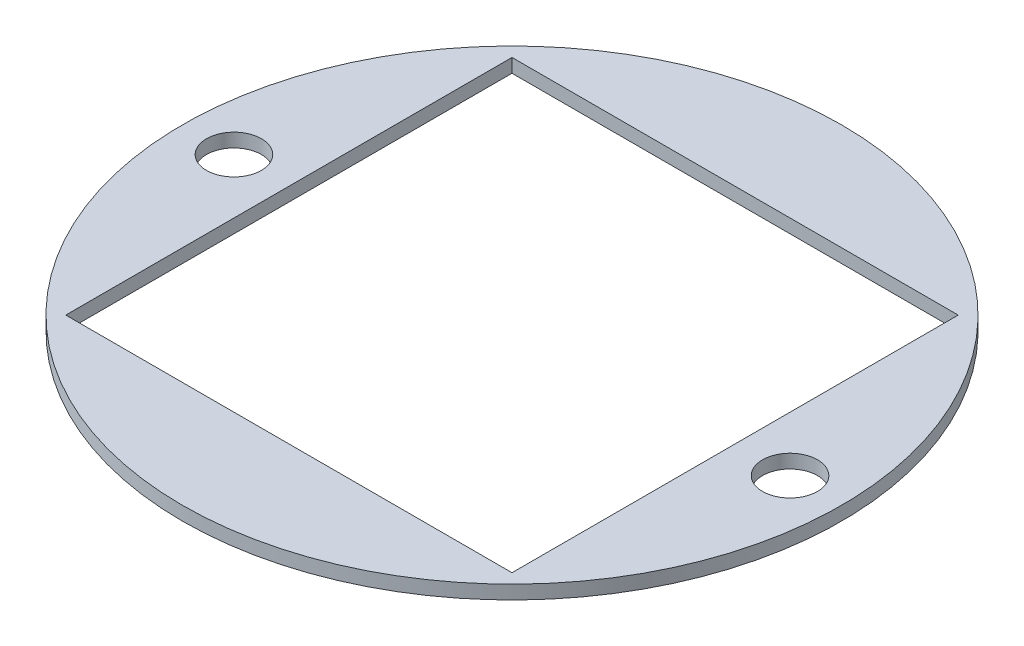
ISO-10303-21;
HEADER;
FILE_DESCRIPTION(('STEP AP214'),'2;1');
FILE_NAME('part.step','',(''),(''),'','','');
FILE_SCHEMA(('AUTOMOTIVE_DESIGN { 1 0 10303 214 1 1 1 1 }'));
ENDSEC;
DATA;
#1=APPLICATION_CONTEXT('core data for automotive mechanical design processes');
#2=APPLICATION_PROTOCOL_DEFINITION('international standard','automotive_design',2000,#1);
#3=PRODUCT_CONTEXT('',#1,'mechanical');
#4=PRODUCT('Part','Part','',(#3));
#5=PRODUCT_RELATED_PRODUCT_CATEGORY('part','',(#4));
#6=PRODUCT_DEFINITION_FORMATION('','',#4);
#7=PRODUCT_DEFINITION_CONTEXT('part definition',#1,'design');
#8=PRODUCT_DEFINITION('design','',#6,#7);
#9=PRODUCT_DEFINITION_SHAPE('','',#8);
#10=(LENGTH_UNIT() NAMED_UNIT(*) SI_UNIT(.MILLI.,.METRE.));
#11=(NAMED_UNIT(*) PLANE_ANGLE_UNIT() SI_UNIT($,.RADIAN.));
#12=(NAMED_UNIT(*) SI_UNIT($,.STERADIAN.) SOLID_ANGLE_UNIT());
#13=UNCERTAINTY_MEASURE_WITH_UNIT(LENGTH_MEASURE(1.E-05),#10,'distance_accuracy_value','');
#14=(GEOMETRIC_REPRESENTATION_CONTEXT(3) GLOBAL_UNCERTAINTY_ASSIGNED_CONTEXT((#13)) GLOBAL_UNIT_ASSIGNED_CONTEXT((#10,
#11,#12)) REPRESENTATION_CONTEXT('',''));
#15=CARTESIAN_POINT('',(0.,0.,0.));
#16=DIRECTION('',(0.,0.,1.));
#17=DIRECTION('',(1.,0.,0.));
#18=AXIS2_PLACEMENT_3D('',#15,#16,#17);
#19=CARTESIAN_POINT('',(0.,3.175,0.));
#20=DIRECTION('',(0.,-1.,0.));
#21=DIRECTION('',(0.,0.,-1.));
#22=AXIS2_PLACEMENT_3D('',#19,#20,#21);
#23=CYLINDRICAL_SURFACE('',#22,76.2);
#24=CARTESIAN_POINT('',(0.,3.175,0.));
#25=DIRECTION('',(0.,1.,0.));
#26=DIRECTION('',(0.,0.,1.));
#27=AXIS2_PLACEMENT_3D('',#24,#25,#26);
#28=CIRCLE('',#27,76.2);
#29=CARTESIAN_POINT('',(0.,3.175,76.2));
#30=VERTEX_POINT('',#29);
#31=EDGE_CURVE('E109',#30,#30,#28,.T.);
#32=ORIENTED_EDGE('',*,*,#31,.F.);
#33=EDGE_LOOP('',(#32));
#34=FACE_BOUND('',#33,.T.);
#35=CARTESIAN_POINT('',(0.,0.,0.));
#36=DIRECTION('',(0.,1.,0.));
#37=DIRECTION('',(0.,0.,1.));
#38=AXIS2_PLACEMENT_3D('',#35,#36,#37);
#39=CIRCLE('',#38,76.2);
#40=CARTESIAN_POINT('',(0.,0.,76.2));
#41=VERTEX_POINT('',#40);
#42=EDGE_CURVE('E113',#41,#41,#39,.T.);
#43=ORIENTED_EDGE('',*,*,#42,.T.);
#44=EDGE_LOOP('',(#43));
#45=FACE_BOUND('',#44,.T.);
#46=ADVANCED_FACE('F33',(#34,#45),#23,.T.);
#47=CARTESIAN_POINT('',(0.,3.175,0.));
#48=DIRECTION('',(0.,1.,0.));
#49=DIRECTION('',(0.,0.,1.));
#50=AXIS2_PLACEMENT_3D('',#47,#48,#49);
#51=PLANE('',#50);
#52=DIRECTION('',(0.,0.,1.));
#53=VECTOR('',#52,1.);
#54=CARTESIAN_POINT('',(-51.5875,3.175,51.5875));
#55=LINE('',#54,#53);
#56=CARTESIAN_POINT('',(-51.5875,3.175,-51.5875));
#57=VERTEX_POINT('',#56);
#58=CARTESIAN_POINT('',(-51.5875,3.175,51.5875));
#59=VERTEX_POINT('',#58);
#60=EDGE_CURVE('E47',#57,#59,#55,.T.);
#61=ORIENTED_EDGE('',*,*,#60,.F.);
#62=DIRECTION('',(-1.,0.,0.));
#63=VECTOR('',#62,1.);
#64=CARTESIAN_POINT('',(51.5875,3.175,-51.5875));
#65=LINE('',#64,#63);
#66=CARTESIAN_POINT('',(51.5875,3.175,-51.5875));
#67=VERTEX_POINT('',#66);
#68=EDGE_CURVE('E92',#67,#57,#65,.T.);
#69=ORIENTED_EDGE('',*,*,#68,.F.);
#70=DIRECTION('',(0.,0.,-1.));
#71=VECTOR('',#70,1.);
#72=CARTESIAN_POINT('',(51.5875,3.175,51.5875));
#73=LINE('',#72,#71);
#74=CARTESIAN_POINT('',(51.5875,3.175,51.5875));
#75=VERTEX_POINT('',#74);
#76=EDGE_CURVE('E76',#75,#67,#73,.T.);
#77=ORIENTED_EDGE('',*,*,#76,.F.);
#78=DIRECTION('',(1.,0.,0.));
#79=VECTOR('',#78,1.);
#80=CARTESIAN_POINT('',(51.5875,3.175,51.5875));
#81=LINE('',#80,#79);
#82=EDGE_CURVE('E85',#59,#75,#81,.T.);
#83=ORIENTED_EDGE('',*,*,#82,.F.);
#84=EDGE_LOOP('',(#61,#69,#77,#83));
#85=FACE_BOUND('',#84,.T.);
#86=CARTESIAN_POINT('',(64.2875,3.175,0.));
#87=DIRECTION('',(0.,1.,0.));
#88=DIRECTION('',(0.,0.,1.));
#89=AXIS2_PLACEMENT_3D('',#86,#87,#88);
#90=CIRCLE('',#89,6.35);
#91=CARTESIAN_POINT('',(64.2875,3.175,6.35));
#92=VERTEX_POINT('',#91);
#93=EDGE_CURVE('E99',#92,#92,#90,.T.);
#94=ORIENTED_EDGE('',*,*,#93,.F.);
#95=EDGE_LOOP('',(#94));
#96=FACE_BOUND('',#95,.T.);
#97=CARTESIAN_POINT('',(-64.2875,3.175,0.));
#98=DIRECTION('',(0.,1.,0.));
#99=DIRECTION('',(0.,0.,1.));
#100=AXIS2_PLACEMENT_3D('',#97,#98,#99);
#101=CIRCLE('',#100,6.35);
#102=CARTESIAN_POINT('',(-64.2875,3.175,6.35));
#103=VERTEX_POINT('',#102);
#104=EDGE_CURVE('E105',#103,#103,#101,.T.);
#105=ORIENTED_EDGE('',*,*,#104,.F.);
#106=EDGE_LOOP('',(#105));
#107=FACE_BOUND('',#106,.T.);
#108=ORIENTED_EDGE('',*,*,#31,.T.);
#109=EDGE_LOOP('',(#108));
#110=FACE_BOUND('',#109,.T.);
#111=ADVANCED_FACE('F89',(#85,#96,#107,#110),#51,.T.);
#112=CARTESIAN_POINT('',(0.,0.,0.));
#113=DIRECTION('',(0.,1.,0.));
#114=DIRECTION('',(0.,0.,1.));
#115=AXIS2_PLACEMENT_3D('',#112,#113,#114);
#116=PLANE('',#115);
#117=DIRECTION('',(-1.,0.,0.));
#118=VECTOR('',#117,1.);
#119=CARTESIAN_POINT('',(0.,0.,-51.5875));
#120=LINE('',#119,#118);
#121=CARTESIAN_POINT('',(51.5875,0.,-51.5875));
#122=VERTEX_POINT('',#121);
#123=CARTESIAN_POINT('',(-51.5875,0.,-51.5875));
#124=VERTEX_POINT('',#123);
#125=EDGE_CURVE('E40',#122,#124,#120,.T.);
#126=ORIENTED_EDGE('',*,*,#125,.T.);
#127=DIRECTION('',(0.,0.,1.));
#128=VECTOR('',#127,1.);
#129=CARTESIAN_POINT('',(-51.5875,0.,0.));
#130=LINE('',#129,#128);
#131=CARTESIAN_POINT('',(-51.5875,0.,51.5875));
#132=VERTEX_POINT('',#131);
#133=EDGE_CURVE('E11',#124,#132,#130,.T.);
#134=ORIENTED_EDGE('',*,*,#133,.T.);
#135=DIRECTION('',(1.,0.,0.));
#136=VECTOR('',#135,1.);
#137=CARTESIAN_POINT('',(0.,0.,51.5875));
#138=LINE('',#137,#136);
#139=CARTESIAN_POINT('',(51.5875,0.,51.5875));
#140=VERTEX_POINT('',#139);
#141=EDGE_CURVE('E112',#132,#140,#138,.T.);
#142=ORIENTED_EDGE('',*,*,#141,.T.);
#143=DIRECTION('',(0.,0.,-1.));
#144=VECTOR('',#143,1.);
#145=CARTESIAN_POINT('',(51.5875,0.,0.));
#146=LINE('',#145,#144);
#147=EDGE_CURVE('E79',#140,#122,#146,.T.);
#148=ORIENTED_EDGE('',*,*,#147,.T.);
#149=EDGE_LOOP('',(#126,#134,#142,#148));
#150=FACE_BOUND('',#149,.T.);
#151=CARTESIAN_POINT('',(64.2875,0.,0.));
#152=DIRECTION('',(0.,1.,0.));
#153=DIRECTION('',(0.,0.,1.));
#154=AXIS2_PLACEMENT_3D('',#151,#152,#153);
#155=CIRCLE('',#154,6.35);
#156=CARTESIAN_POINT('',(64.2875,0.,6.35));
#157=VERTEX_POINT('',#156);
#158=EDGE_CURVE('E104',#157,#157,#155,.T.);
#159=ORIENTED_EDGE('',*,*,#158,.T.);
#160=EDGE_LOOP('',(#159));
#161=FACE_BOUND('',#160,.T.);
#162=CARTESIAN_POINT('',(-64.2875,0.,0.));
#163=DIRECTION('',(0.,1.,0.));
#164=DIRECTION('',(0.,0.,1.));
#165=AXIS2_PLACEMENT_3D('',#162,#163,#164);
#166=CIRCLE('',#165,6.35);
#167=CARTESIAN_POINT('',(-64.2875,0.,6.35));
#168=VERTEX_POINT('',#167);
#169=EDGE_CURVE('E108',#168,#168,#166,.T.);
#170=ORIENTED_EDGE('',*,*,#169,.T.);
#171=EDGE_LOOP('',(#170));
#172=FACE_BOUND('',#171,.T.);
#173=ORIENTED_EDGE('',*,*,#42,.F.);
#174=EDGE_LOOP('',(#173));
#175=FACE_BOUND('',#174,.T.);
#176=ADVANCED_FACE('F123',(#150,#161,#172,#175),#116,.F.);
#177=CARTESIAN_POINT('',(-64.2875,-6.825,0.));
#178=DIRECTION('',(0.,1.,0.));
#179=DIRECTION('',(0.,0.,1.));
#180=AXIS2_PLACEMENT_3D('',#177,#178,#179);
#181=CYLINDRICAL_SURFACE('',#180,6.35);
#182=ORIENTED_EDGE('',*,*,#104,.T.);
#183=EDGE_LOOP('',(#182));
#184=FACE_BOUND('',#183,.T.);
#185=ORIENTED_EDGE('',*,*,#169,.F.);
#186=EDGE_LOOP('',(#185));
#187=FACE_BOUND('',#186,.T.);
#188=ADVANCED_FACE('F137',(#184,#187),#181,.F.);
#189=CARTESIAN_POINT('',(64.2875,-6.825,0.));
#190=DIRECTION('',(0.,1.,0.));
#191=DIRECTION('',(0.,0.,1.));
#192=AXIS2_PLACEMENT_3D('',#189,#190,#191);
#193=CYLINDRICAL_SURFACE('',#192,6.35);
#194=ORIENTED_EDGE('',*,*,#93,.T.);
#195=EDGE_LOOP('',(#194));
#196=FACE_BOUND('',#195,.T.);
#197=ORIENTED_EDGE('',*,*,#158,.F.);
#198=EDGE_LOOP('',(#197));
#199=FACE_BOUND('',#198,.T.);
#200=ADVANCED_FACE('F130',(#196,#199),#193,.F.);
#201=CARTESIAN_POINT('',(-51.5875,-6.825,51.5875));
#202=DIRECTION('',(-1.,0.,0.));
#203=DIRECTION('',(0.,0.,1.));
#204=AXIS2_PLACEMENT_3D('',#201,#202,#203);
#205=PLANE('',#204);
#206=DIRECTION('',(0.,1.,0.));
#207=VECTOR('',#206,1.);
#208=CARTESIAN_POINT('',(-51.5875,-6.825,-51.5875));
#209=LINE('',#208,#207);
#210=EDGE_CURVE('E97',#124,#57,#209,.T.);
#211=ORIENTED_EDGE('',*,*,#210,.T.);
#212=ORIENTED_EDGE('',*,*,#60,.T.);
#213=DIRECTION('',(0.,1.,0.));
#214=VECTOR('',#213,1.);
#215=CARTESIAN_POINT('',(-51.5875,-6.825,51.5875));
#216=LINE('',#215,#214);
#217=EDGE_CURVE('E82',#132,#59,#216,.T.);
#218=ORIENTED_EDGE('',*,*,#217,.F.);
#219=ORIENTED_EDGE('',*,*,#133,.F.);
#220=EDGE_LOOP('',(#211,#212,#218,#219));
#221=FACE_BOUND('',#220,.T.);
#222=ADVANCED_FACE('F128',(#221),#205,.F.);
#223=CARTESIAN_POINT('',(51.5875,-6.825,-51.5875));
#224=DIRECTION('',(0.,0.,-1.));
#225=DIRECTION('',(-1.,0.,0.));
#226=AXIS2_PLACEMENT_3D('',#223,#224,#225);
#227=PLANE('',#226);
#228=DIRECTION('',(0.,1.,0.));
#229=VECTOR('',#228,1.);
#230=CARTESIAN_POINT('',(51.5875,-6.825,-51.5875));
#231=LINE('',#230,#229);
#232=EDGE_CURVE('E81',#122,#67,#231,.T.);
#233=ORIENTED_EDGE('',*,*,#232,.T.);
#234=ORIENTED_EDGE('',*,*,#68,.T.);
#235=ORIENTED_EDGE('',*,*,#210,.F.);
#236=ORIENTED_EDGE('',*,*,#125,.F.);
#237=EDGE_LOOP('',(#233,#234,#235,#236));
#238=FACE_BOUND('',#237,.T.);
#239=ADVANCED_FACE('F127',(#238),#227,.F.);
#240=CARTESIAN_POINT('',(51.5875,-6.825,51.5875));
#241=DIRECTION('',(1.,0.,0.));
#242=DIRECTION('',(0.,0.,-1.));
#243=AXIS2_PLACEMENT_3D('',#240,#241,#242);
#244=PLANE('',#243);
#245=DIRECTION('',(0.,1.,0.));
#246=VECTOR('',#245,1.);
#247=CARTESIAN_POINT('',(51.5875,-6.825,51.5875));
#248=LINE('',#247,#246);
#249=EDGE_CURVE('E55',#140,#75,#248,.T.);
#250=ORIENTED_EDGE('',*,*,#249,.T.);
#251=ORIENTED_EDGE('',*,*,#76,.T.);
#252=ORIENTED_EDGE('',*,*,#232,.F.);
#253=ORIENTED_EDGE('',*,*,#147,.F.);
#254=EDGE_LOOP('',(#250,#251,#252,#253));
#255=FACE_BOUND('',#254,.T.);
#256=ADVANCED_FACE('F73',(#255),#244,.F.);
#257=CARTESIAN_POINT('',(51.5875,-6.825,51.5875));
#258=DIRECTION('',(0.,0.,1.));
#259=DIRECTION('',(1.,0.,0.));
#260=AXIS2_PLACEMENT_3D('',#257,#258,#259);
#261=PLANE('',#260);
#262=ORIENTED_EDGE('',*,*,#217,.T.);
#263=ORIENTED_EDGE('',*,*,#82,.T.);
#264=ORIENTED_EDGE('',*,*,#249,.F.);
#265=ORIENTED_EDGE('',*,*,#141,.F.);
#266=EDGE_LOOP('',(#262,#263,#264,#265));
#267=FACE_BOUND('',#266,.T.);
#268=ADVANCED_FACE('F86',(#267),#261,.F.);
#269=CLOSED_SHELL('',(#46,#111,#176,#188,#200,#222,#239,#256,#268));
#270=MANIFOLD_SOLID_BREP('B2',#269);
#271=ADVANCED_BREP_SHAPE_REPRESENTATION('',(#18,#270),#14);
#272=SHAPE_DEFINITION_REPRESENTATION(#9,#271);
ENDSEC;
END-ISO-10303-21;
